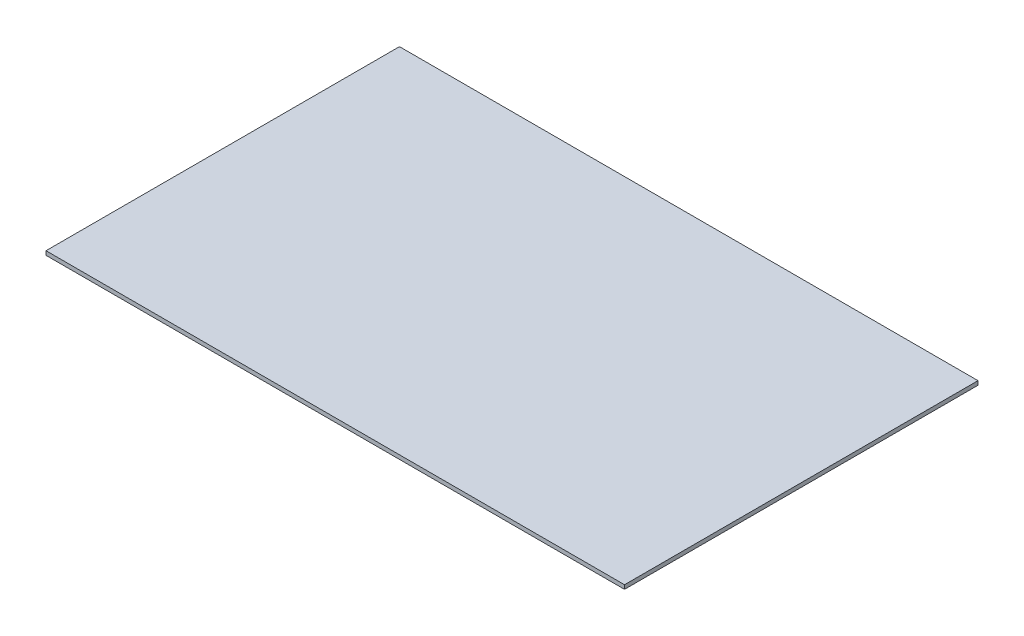
ISO-10303-21;
HEADER;
FILE_DESCRIPTION(('STEP AP214'),'2;1');
FILE_NAME('part.step','',(''),(''),'','','');
FILE_SCHEMA(('AUTOMOTIVE_DESIGN { 1 0 10303 214 1 1 1 1 }'));
ENDSEC;
DATA;
#1=APPLICATION_CONTEXT('core data for automotive mechanical design processes');
#2=APPLICATION_PROTOCOL_DEFINITION('international standard','automotive_design',2000,#1);
#3=PRODUCT_CONTEXT('',#1,'mechanical');
#4=PRODUCT('Part','Part','',(#3));
#5=PRODUCT_RELATED_PRODUCT_CATEGORY('part','',(#4));
#6=PRODUCT_DEFINITION_FORMATION('','',#4);
#7=PRODUCT_DEFINITION_CONTEXT('part definition',#1,'design');
#8=PRODUCT_DEFINITION('design','',#6,#7);
#9=PRODUCT_DEFINITION_SHAPE('','',#8);
#10=(LENGTH_UNIT() NAMED_UNIT(*) SI_UNIT(.MILLI.,.METRE.));
#11=(NAMED_UNIT(*) PLANE_ANGLE_UNIT() SI_UNIT($,.RADIAN.));
#12=(NAMED_UNIT(*) SI_UNIT($,.STERADIAN.) SOLID_ANGLE_UNIT());
#13=UNCERTAINTY_MEASURE_WITH_UNIT(LENGTH_MEASURE(1.E-05),#10,'distance_accuracy_value','');
#14=(GEOMETRIC_REPRESENTATION_CONTEXT(3) GLOBAL_UNCERTAINTY_ASSIGNED_CONTEXT((#13)) GLOBAL_UNIT_ASSIGNED_CONTEXT((#10,
#11,#12)) REPRESENTATION_CONTEXT('',''));
#15=CARTESIAN_POINT('',(0.,0.,0.));
#16=DIRECTION('',(0.,0.,1.));
#17=DIRECTION('',(1.,0.,0.));
#18=AXIS2_PLACEMENT_3D('',#15,#16,#17);
#19=CARTESIAN_POINT('',(0.,9.525,0.));
#20=DIRECTION('',(1.,0.,0.));
#21=DIRECTION('',(0.,0.,-1.));
#22=AXIS2_PLACEMENT_3D('',#19,#20,#21);
#23=PLANE('',#22);
#24=DIRECTION('',(0.,0.,1.));
#25=VECTOR('',#24,1.);
#26=CARTESIAN_POINT('',(0.,0.,0.));
#27=LINE('',#26,#25);
#28=CARTESIAN_POINT('',(0.,0.,-837.05));
#29=VERTEX_POINT('',#28);
#30=CARTESIAN_POINT('',(0.,0.,0.));
#31=VERTEX_POINT('',#30);
#32=EDGE_CURVE('E111',#29,#31,#27,.T.);
#33=ORIENTED_EDGE('',*,*,#32,.T.);
#34=DIRECTION('',(0.,-1.,0.));
#35=VECTOR('',#34,1.);
#36=CARTESIAN_POINT('',(0.,9.525,0.));
#37=LINE('',#36,#35);
#38=CARTESIAN_POINT('',(0.,9.525,0.));
#39=VERTEX_POINT('',#38);
#40=EDGE_CURVE('E11',#39,#31,#37,.T.);
#41=ORIENTED_EDGE('',*,*,#40,.F.);
#42=DIRECTION('',(0.,0.,1.));
#43=VECTOR('',#42,1.);
#44=CARTESIAN_POINT('',(0.,9.525,0.));
#45=LINE('',#44,#43);
#46=CARTESIAN_POINT('',(0.,9.525,-837.05));
#47=VERTEX_POINT('',#46);
#48=EDGE_CURVE('E95',#47,#39,#45,.T.);
#49=ORIENTED_EDGE('',*,*,#48,.F.);
#50=DIRECTION('',(0.,-1.,0.));
#51=VECTOR('',#50,1.);
#52=CARTESIAN_POINT('',(0.,9.525,-837.05));
#53=LINE('',#52,#51);
#54=EDGE_CURVE('E107',#47,#29,#53,.T.);
#55=ORIENTED_EDGE('',*,*,#54,.T.);
#56=EDGE_LOOP('',(#33,#41,#49,#55));
#57=FACE_BOUND('',#56,.T.);
#58=ADVANCED_FACE('F43',(#57),#23,.F.);
#59=CARTESIAN_POINT('',(0.,9.525,0.));
#60=DIRECTION('',(0.,0.,-1.));
#61=DIRECTION('',(-1.,0.,0.));
#62=AXIS2_PLACEMENT_3D('',#59,#60,#61);
#63=PLANE('',#62);
#64=DIRECTION('',(1.,0.,0.));
#65=VECTOR('',#64,1.);
#66=CARTESIAN_POINT('',(0.,0.,0.));
#67=LINE('',#66,#65);
#68=CARTESIAN_POINT('',(1370.,0.,0.));
#69=VERTEX_POINT('',#68);
#70=EDGE_CURVE('E100',#31,#69,#67,.T.);
#71=ORIENTED_EDGE('',*,*,#70,.T.);
#72=DIRECTION('',(0.,-1.,0.));
#73=VECTOR('',#72,1.);
#74=CARTESIAN_POINT('',(1370.,9.525,0.));
#75=LINE('',#74,#73);
#76=CARTESIAN_POINT('',(1370.,9.525,0.));
#77=VERTEX_POINT('',#76);
#78=EDGE_CURVE('E52',#77,#69,#75,.T.);
#79=ORIENTED_EDGE('',*,*,#78,.F.);
#80=DIRECTION('',(1.,0.,0.));
#81=VECTOR('',#80,1.);
#82=CARTESIAN_POINT('',(0.,9.525,0.));
#83=LINE('',#82,#81);
#84=EDGE_CURVE('E90',#39,#77,#83,.T.);
#85=ORIENTED_EDGE('',*,*,#84,.F.);
#86=ORIENTED_EDGE('',*,*,#40,.T.);
#87=EDGE_LOOP('',(#71,#79,#85,#86));
#88=FACE_BOUND('',#87,.T.);
#89=ADVANCED_FACE('F99',(#88),#63,.F.);
#90=CARTESIAN_POINT('',(1370.,9.525,0.));
#91=DIRECTION('',(-1.,0.,0.));
#92=DIRECTION('',(0.,0.,1.));
#93=AXIS2_PLACEMENT_3D('',#90,#91,#92);
#94=PLANE('',#93);
#95=DIRECTION('',(0.,0.,-1.));
#96=VECTOR('',#95,1.);
#97=CARTESIAN_POINT('',(1370.,0.,0.));
#98=LINE('',#97,#96);
#99=CARTESIAN_POINT('',(1370.,0.,-837.05));
#100=VERTEX_POINT('',#99);
#101=EDGE_CURVE('E77',#69,#100,#98,.T.);
#102=ORIENTED_EDGE('',*,*,#101,.T.);
#103=DIRECTION('',(0.,-1.,0.));
#104=VECTOR('',#103,1.);
#105=CARTESIAN_POINT('',(1370.,9.525,-837.05));
#106=LINE('',#105,#104);
#107=CARTESIAN_POINT('',(1370.,9.525,-837.05));
#108=VERTEX_POINT('',#107);
#109=EDGE_CURVE('E102',#108,#100,#106,.T.);
#110=ORIENTED_EDGE('',*,*,#109,.F.);
#111=DIRECTION('',(0.,0.,-1.));
#112=VECTOR('',#111,1.);
#113=CARTESIAN_POINT('',(1370.,9.525,0.));
#114=LINE('',#113,#112);
#115=EDGE_CURVE('E93',#77,#108,#114,.T.);
#116=ORIENTED_EDGE('',*,*,#115,.F.);
#117=ORIENTED_EDGE('',*,*,#78,.T.);
#118=EDGE_LOOP('',(#102,#110,#116,#117));
#119=FACE_BOUND('',#118,.T.);
#120=ADVANCED_FACE('F103',(#119),#94,.F.);
#121=CARTESIAN_POINT('',(0.,9.525,-837.05));
#122=DIRECTION('',(0.,0.,1.));
#123=DIRECTION('',(1.,0.,0.));
#124=AXIS2_PLACEMENT_3D('',#121,#122,#123);
#125=PLANE('',#124);
#126=DIRECTION('',(-1.,0.,0.));
#127=VECTOR('',#126,1.);
#128=CARTESIAN_POINT('',(0.,0.,-837.05));
#129=LINE('',#128,#127);
#130=EDGE_CURVE('E83',#100,#29,#129,.T.);
#131=ORIENTED_EDGE('',*,*,#130,.T.);
#132=ORIENTED_EDGE('',*,*,#54,.F.);
#133=DIRECTION('',(-1.,0.,0.));
#134=VECTOR('',#133,1.);
#135=CARTESIAN_POINT('',(0.,9.525,-837.05));
#136=LINE('',#135,#134);
#137=EDGE_CURVE('E60',#108,#47,#136,.T.);
#138=ORIENTED_EDGE('',*,*,#137,.F.);
#139=ORIENTED_EDGE('',*,*,#109,.T.);
#140=EDGE_LOOP('',(#131,#132,#138,#139));
#141=FACE_BOUND('',#140,.T.);
#142=ADVANCED_FACE('F124',(#141),#125,.F.);
#143=CARTESIAN_POINT('',(0.,9.525,0.));
#144=DIRECTION('',(0.,-1.,0.));
#145=DIRECTION('',(0.,0.,-1.));
#146=AXIS2_PLACEMENT_3D('',#143,#144,#145);
#147=PLANE('',#146);
#148=ORIENTED_EDGE('',*,*,#48,.T.);
#149=ORIENTED_EDGE('',*,*,#84,.T.);
#150=ORIENTED_EDGE('',*,*,#115,.T.);
#151=ORIENTED_EDGE('',*,*,#137,.T.);
#152=EDGE_LOOP('',(#148,#149,#150,#151));
#153=FACE_BOUND('',#152,.T.);
#154=ADVANCED_FACE('F91',(#153),#147,.F.);
#155=CARTESIAN_POINT('',(0.,0.,0.));
#156=DIRECTION('',(0.,-1.,0.));
#157=DIRECTION('',(0.,0.,-1.));
#158=AXIS2_PLACEMENT_3D('',#155,#156,#157);
#159=PLANE('',#158);
#160=ORIENTED_EDGE('',*,*,#32,.F.);
#161=ORIENTED_EDGE('',*,*,#130,.F.);
#162=ORIENTED_EDGE('',*,*,#101,.F.);
#163=ORIENTED_EDGE('',*,*,#70,.F.);
#164=EDGE_LOOP('',(#160,#161,#162,#163));
#165=FACE_BOUND('',#164,.T.);
#166=ADVANCED_FACE('F127',(#165),#159,.T.);
#167=CLOSED_SHELL('',(#58,#89,#120,#142,#154,#166));
#168=MANIFOLD_SOLID_BREP('B2',#167);
#169=ADVANCED_BREP_SHAPE_REPRESENTATION('',(#18,#168),#14);
#170=SHAPE_DEFINITION_REPRESENTATION(#9,#169);
ENDSEC;
END-ISO-10303-21;
